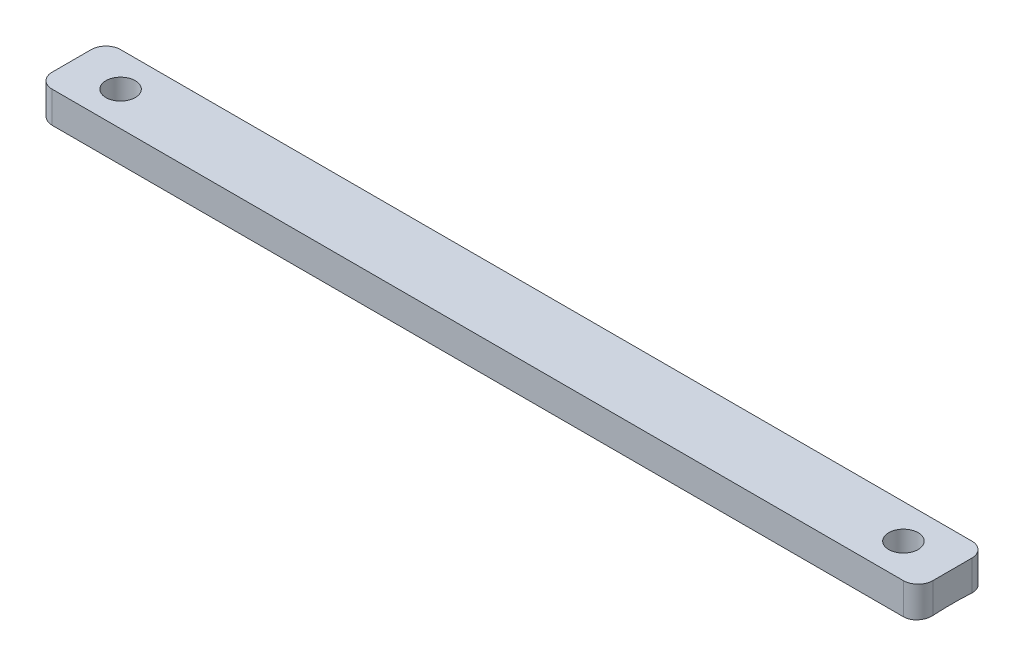
ISO-10303-21;
HEADER;
FILE_DESCRIPTION(('STEP AP214'),'2;1');
FILE_NAME('part.step','',(''),(''),'','','');
FILE_SCHEMA(('AUTOMOTIVE_DESIGN { 1 0 10303 214 1 1 1 1 }'));
ENDSEC;
DATA;
#1=APPLICATION_CONTEXT('core data for automotive mechanical design processes');
#2=APPLICATION_PROTOCOL_DEFINITION('international standard','automotive_design',2000,#1);
#3=PRODUCT_CONTEXT('',#1,'mechanical');
#4=PRODUCT('Part','Part','',(#3));
#5=PRODUCT_RELATED_PRODUCT_CATEGORY('part','',(#4));
#6=PRODUCT_DEFINITION_FORMATION('','',#4);
#7=PRODUCT_DEFINITION_CONTEXT('part definition',#1,'design');
#8=PRODUCT_DEFINITION('design','',#6,#7);
#9=PRODUCT_DEFINITION_SHAPE('','',#8);
#10=(LENGTH_UNIT() NAMED_UNIT(*) SI_UNIT(.MILLI.,.METRE.));
#11=(NAMED_UNIT(*) PLANE_ANGLE_UNIT() SI_UNIT($,.RADIAN.));
#12=(NAMED_UNIT(*) SI_UNIT($,.STERADIAN.) SOLID_ANGLE_UNIT());
#13=UNCERTAINTY_MEASURE_WITH_UNIT(LENGTH_MEASURE(1.E-05),#10,'distance_accuracy_value','');
#14=(GEOMETRIC_REPRESENTATION_CONTEXT(3) GLOBAL_UNCERTAINTY_ASSIGNED_CONTEXT((#13)) GLOBAL_UNIT_ASSIGNED_CONTEXT((#10,
#11,#12)) REPRESENTATION_CONTEXT('',''));
#15=CARTESIAN_POINT('',(0.,0.,0.));
#16=DIRECTION('',(0.,0.,1.));
#17=DIRECTION('',(1.,0.,0.));
#18=AXIS2_PLACEMENT_3D('',#15,#16,#17);
#19=CARTESIAN_POINT('',(0.,3.2,0.));
#20=DIRECTION('',(0.,-1.,0.));
#21=DIRECTION('',(0.,0.,-1.));
#22=AXIS2_PLACEMENT_3D('',#19,#20,#21);
#23=PLANE('',#22);
#24=DIRECTION('',(-1.,0.,0.));
#25=VECTOR('',#24,1.);
#26=CARTESIAN_POINT('',(0.,3.2,-7.));
#27=LINE('',#26,#25);
#28=CARTESIAN_POINT('',(88.5,3.2,-7.));
#29=VERTEX_POINT('',#28);
#30=CARTESIAN_POINT('',(1.5,3.2,-7.));
#31=VERTEX_POINT('',#30);
#32=EDGE_CURVE('E244',#29,#31,#27,.T.);
#33=ORIENTED_EDGE('',*,*,#32,.T.);
#34=CARTESIAN_POINT('',(1.5,3.2,-5.5));
#35=DIRECTION('',(0.,-1.,0.));
#36=DIRECTION('',(0.,0.,-1.));
#37=AXIS2_PLACEMENT_3D('',#34,#35,#36);
#38=CIRCLE('',#37,1.5);
#39=CARTESIAN_POINT('',(0.,3.2,-5.5));
#40=VERTEX_POINT('',#39);
#41=EDGE_CURVE('E231',#31,#40,#38,.F.);
#42=ORIENTED_EDGE('',*,*,#41,.T.);
#43=DIRECTION('',(0.,0.,1.));
#44=VECTOR('',#43,1.);
#45=CARTESIAN_POINT('',(0.,3.2,0.));
#46=LINE('',#45,#44);
#47=CARTESIAN_POINT('',(0.,3.2,-1.5));
#48=VERTEX_POINT('',#47);
#49=EDGE_CURVE('E120',#40,#48,#46,.T.);
#50=ORIENTED_EDGE('',*,*,#49,.T.);
#51=CARTESIAN_POINT('',(1.5,3.2,-1.5));
#52=DIRECTION('',(0.,-1.,0.));
#53=DIRECTION('',(0.,0.,-1.));
#54=AXIS2_PLACEMENT_3D('',#51,#52,#53);
#55=CIRCLE('',#54,1.5);
#56=CARTESIAN_POINT('',(1.5,3.2,0.));
#57=VERTEX_POINT('',#56);
#58=EDGE_CURVE('E229',#48,#57,#55,.F.);
#59=ORIENTED_EDGE('',*,*,#58,.T.);
#60=DIRECTION('',(1.,0.,0.));
#61=VECTOR('',#60,1.);
#62=CARTESIAN_POINT('',(0.,3.2,0.));
#63=LINE('',#62,#61);
#64=CARTESIAN_POINT('',(88.5,3.2,0.));
#65=VERTEX_POINT('',#64);
#66=EDGE_CURVE('E246',#57,#65,#63,.T.);
#67=ORIENTED_EDGE('',*,*,#66,.T.);
#68=CARTESIAN_POINT('',(88.5,3.2,-1.5));
#69=DIRECTION('',(0.,-1.,0.));
#70=DIRECTION('',(0.,0.,-1.));
#71=AXIS2_PLACEMENT_3D('',#68,#69,#70);
#72=CIRCLE('',#71,1.5);
#73=CARTESIAN_POINT('',(90.,3.2,-1.5));
#74=VERTEX_POINT('',#73);
#75=EDGE_CURVE('E56',#65,#74,#72,.F.);
#76=ORIENTED_EDGE('',*,*,#75,.T.);
#77=DIRECTION('',(0.,0.,-1.));
#78=VECTOR('',#77,1.);
#79=CARTESIAN_POINT('',(90.,3.2,0.));
#80=LINE('',#79,#78);
#81=CARTESIAN_POINT('',(90.,3.2,-5.5));
#82=VERTEX_POINT('',#81);
#83=EDGE_CURVE('E239',#74,#82,#80,.T.);
#84=ORIENTED_EDGE('',*,*,#83,.T.);
#85=CARTESIAN_POINT('',(88.5,3.2,-5.5));
#86=DIRECTION('',(0.,-1.,0.));
#87=DIRECTION('',(0.,0.,-1.));
#88=AXIS2_PLACEMENT_3D('',#85,#86,#87);
#89=CIRCLE('',#88,1.5);
#90=EDGE_CURVE('E228',#82,#29,#89,.F.);
#91=ORIENTED_EDGE('',*,*,#90,.T.);
#92=EDGE_LOOP('',(#33,#42,#50,#59,#67,#76,#84,#91));
#93=FACE_BOUND('',#92,.T.);
#94=CARTESIAN_POINT('',(5.,3.2,-3.5));
#95=DIRECTION('',(0.,1.,0.));
#96=DIRECTION('',(0.,0.,1.));
#97=AXIS2_PLACEMENT_3D('',#94,#95,#96);
#98=CIRCLE('',#97,1.5);
#99=CARTESIAN_POINT('',(5.,3.2,-2.));
#100=VERTEX_POINT('',#99);
#101=EDGE_CURVE('E224',#100,#100,#98,.T.);
#102=ORIENTED_EDGE('',*,*,#101,.F.);
#103=EDGE_LOOP('',(#102));
#104=FACE_BOUND('',#103,.T.);
#105=CARTESIAN_POINT('',(85.,3.2,-3.5));
#106=DIRECTION('',(0.,1.,0.));
#107=DIRECTION('',(0.,0.,1.));
#108=AXIS2_PLACEMENT_3D('',#105,#106,#107);
#109=CIRCLE('',#108,1.5);
#110=CARTESIAN_POINT('',(85.,3.2,-2.));
#111=VERTEX_POINT('',#110);
#112=EDGE_CURVE('E140',#111,#111,#109,.T.);
#113=ORIENTED_EDGE('',*,*,#112,.F.);
#114=EDGE_LOOP('',(#113));
#115=FACE_BOUND('',#114,.T.);
#116=ADVANCED_FACE('F33',(#93,#104,#115),#23,.F.);
#117=CARTESIAN_POINT('',(0.,3.2,0.));
#118=DIRECTION('',(1.,0.,0.));
#119=DIRECTION('',(0.,0.,-1.));
#120=AXIS2_PLACEMENT_3D('',#117,#118,#119);
#121=PLANE('',#120);
#122=ORIENTED_EDGE('',*,*,#49,.F.);
#123=DIRECTION('',(0.,-1.,0.));
#124=VECTOR('',#123,1.);
#125=CARTESIAN_POINT('',(0.,3.2,-5.5));
#126=LINE('',#125,#124);
#127=CARTESIAN_POINT('',(0.,0.111818930396308,-5.5));
#128=VERTEX_POINT('',#127);
#129=EDGE_CURVE('E104',#40,#128,#126,.T.);
#130=ORIENTED_EDGE('',*,*,#129,.T.);
#131=CARTESIAN_POINT('',(0.,-36.834087473426,-3.5));
#132=DIRECTION('',(1.,0.,0.));
#133=DIRECTION('',(0.,0.,-1.));
#134=AXIS2_PLACEMENT_3D('',#131,#132,#133);
#135=CIRCLE('',#134,37.);
#136=CARTESIAN_POINT('',(0.,0.111818930396308,-1.5));
#137=VERTEX_POINT('',#136);
#138=EDGE_CURVE('E117',#128,#137,#135,.T.);
#139=ORIENTED_EDGE('',*,*,#138,.T.);
#140=DIRECTION('',(0.,-1.,0.));
#141=VECTOR('',#140,1.);
#142=CARTESIAN_POINT('',(0.,3.2,-1.5));
#143=LINE('',#142,#141);
#144=EDGE_CURVE('E122',#137,#48,#143,.F.);
#145=ORIENTED_EDGE('',*,*,#144,.T.);
#146=EDGE_LOOP('',(#122,#130,#139,#145));
#147=FACE_BOUND('',#146,.T.);
#148=ADVANCED_FACE('F116',(#147),#121,.F.);
#149=CARTESIAN_POINT('',(0.,3.2,0.));
#150=DIRECTION('',(0.,0.,-1.));
#151=DIRECTION('',(-1.,0.,0.));
#152=AXIS2_PLACEMENT_3D('',#149,#150,#151);
#153=PLANE('',#152);
#154=DIRECTION('',(1.,0.,0.));
#155=VECTOR('',#154,1.);
#156=CARTESIAN_POINT('',(0.,0.,0.));
#157=LINE('',#156,#155);
#158=CARTESIAN_POINT('',(1.5,0.,0.));
#159=VERTEX_POINT('',#158);
#160=CARTESIAN_POINT('',(88.5,0.,0.));
#161=VERTEX_POINT('',#160);
#162=EDGE_CURVE('E219',#159,#161,#157,.T.);
#163=ORIENTED_EDGE('',*,*,#162,.T.);
#164=DIRECTION('',(0.,-1.,0.));
#165=VECTOR('',#164,1.);
#166=CARTESIAN_POINT('',(88.5,3.2,0.));
#167=LINE('',#166,#165);
#168=EDGE_CURVE('E11',#161,#65,#167,.F.);
#169=ORIENTED_EDGE('',*,*,#168,.T.);
#170=ORIENTED_EDGE('',*,*,#66,.F.);
#171=DIRECTION('',(0.,-1.,0.));
#172=VECTOR('',#171,1.);
#173=CARTESIAN_POINT('',(1.5,3.2,0.));
#174=LINE('',#173,#172);
#175=EDGE_CURVE('E42',#57,#159,#174,.T.);
#176=ORIENTED_EDGE('',*,*,#175,.T.);
#177=EDGE_LOOP('',(#163,#169,#170,#176));
#178=FACE_BOUND('',#177,.T.);
#179=ADVANCED_FACE('F202',(#178),#153,.F.);
#180=CARTESIAN_POINT('',(90.,3.2,0.));
#181=DIRECTION('',(-1.,0.,0.));
#182=DIRECTION('',(0.,0.,1.));
#183=AXIS2_PLACEMENT_3D('',#180,#181,#182);
#184=PLANE('',#183);
#185=CARTESIAN_POINT('',(90.,-36.834087473426,-3.5));
#186=DIRECTION('',(1.,0.,0.));
#187=DIRECTION('',(0.,0.,-1.));
#188=AXIS2_PLACEMENT_3D('',#185,#186,#187);
#189=CIRCLE('',#188,37.);
#190=CARTESIAN_POINT('',(90.,0.111818930396308,-5.5));
#191=VERTEX_POINT('',#190);
#192=CARTESIAN_POINT('',(90.,0.111818930396308,-1.5));
#193=VERTEX_POINT('',#192);
#194=EDGE_CURVE('E139',#191,#193,#189,.T.);
#195=ORIENTED_EDGE('',*,*,#194,.F.);
#196=DIRECTION('',(0.,-1.,0.));
#197=VECTOR('',#196,1.);
#198=CARTESIAN_POINT('',(90.,3.2,-5.5));
#199=LINE('',#198,#197);
#200=EDGE_CURVE('E49',#191,#82,#199,.F.);
#201=ORIENTED_EDGE('',*,*,#200,.T.);
#202=ORIENTED_EDGE('',*,*,#83,.F.);
#203=DIRECTION('',(0.,-1.,0.));
#204=VECTOR('',#203,1.);
#205=CARTESIAN_POINT('',(90.,3.2,-1.5));
#206=LINE('',#205,#204);
#207=EDGE_CURVE('E227',#74,#193,#206,.T.);
#208=ORIENTED_EDGE('',*,*,#207,.T.);
#209=EDGE_LOOP('',(#195,#201,#202,#208));
#210=FACE_BOUND('',#209,.T.);
#211=ADVANCED_FACE('F209',(#210),#184,.F.);
#212=CARTESIAN_POINT('',(0.,3.2,-7.));
#213=DIRECTION('',(0.,0.,1.));
#214=DIRECTION('',(1.,0.,0.));
#215=AXIS2_PLACEMENT_3D('',#212,#213,#214);
#216=PLANE('',#215);
#217=DIRECTION('',(-1.,0.,0.));
#218=VECTOR('',#217,1.);
#219=CARTESIAN_POINT('',(0.,0.,-7.));
#220=LINE('',#219,#218);
#221=CARTESIAN_POINT('',(88.5,0.,-7.));
#222=VERTEX_POINT('',#221);
#223=CARTESIAN_POINT('',(1.5,0.,-7.));
#224=VERTEX_POINT('',#223);
#225=EDGE_CURVE('E223',#222,#224,#220,.T.);
#226=ORIENTED_EDGE('',*,*,#225,.T.);
#227=DIRECTION('',(0.,-1.,0.));
#228=VECTOR('',#227,1.);
#229=CARTESIAN_POINT('',(1.5,3.2,-7.));
#230=LINE('',#229,#228);
#231=EDGE_CURVE('E105',#224,#31,#230,.F.);
#232=ORIENTED_EDGE('',*,*,#231,.T.);
#233=ORIENTED_EDGE('',*,*,#32,.F.);
#234=DIRECTION('',(0.,-1.,0.));
#235=VECTOR('',#234,1.);
#236=CARTESIAN_POINT('',(88.5,3.2,-7.));
#237=LINE('',#236,#235);
#238=EDGE_CURVE('E110',#29,#222,#237,.T.);
#239=ORIENTED_EDGE('',*,*,#238,.T.);
#240=EDGE_LOOP('',(#226,#232,#233,#239));
#241=FACE_BOUND('',#240,.T.);
#242=ADVANCED_FACE('F206',(#241),#216,.F.);
#243=CARTESIAN_POINT('',(5.,3.2,-3.5));
#244=DIRECTION('',(0.,-1.,0.));
#245=DIRECTION('',(0.,0.,-1.));
#246=AXIS2_PLACEMENT_3D('',#243,#244,#245);
#247=CYLINDRICAL_SURFACE('',#246,1.5);
#248=CARTESIAN_POINT('',(5.,0.135494617801352,-5.));
#249=CARTESIAN_POINT('',(4.91578149422969,0.135495027395254,-4.99999627675517));
#250=CARTESIAN_POINT('',(4.83150280330698,0.135785490756815,-4.9928834288181));
#251=CARTESIAN_POINT('',(4.66526904939991,0.136916204404326,-4.96460899887275));
#252=CARTESIAN_POINT('',(4.58331686499343,0.137757107244809,-4.94343074166795));
#253=CARTESIAN_POINT('',(4.42416832708252,0.139893288807477,-4.88763166685569));
#254=CARTESIAN_POINT('',(4.34696962375158,0.141188340871768,-4.85301755392828));
#255=CARTESIAN_POINT('',(4.19949975976174,0.144086606503954,-4.77133927142248));
#256=CARTESIAN_POINT('',(4.12922693956124,0.14568974597674,-4.72427809434462));
#257=CARTESIAN_POINT('',(3.99753211459871,0.149024864230531,-4.6190034425289));
#258=CARTESIAN_POINT('',(3.93611560786369,0.150756922041597,-4.56078309192671));
#259=CARTESIAN_POINT('',(3.82392345672616,0.154153946140237,-4.43485590545194));
#260=CARTESIAN_POINT('',(3.77314824097075,0.155818909722974,-4.3671486876174));
#261=CARTESIAN_POINT('',(3.68366712391673,0.158894625039714,-4.22414384124868));
#262=CARTESIAN_POINT('',(3.64496516265188,0.160305293722843,-4.14884374541066));
#263=CARTESIAN_POINT('',(3.58075455080634,0.162712688784949,-3.99280808054436));
#264=CARTESIAN_POINT('',(3.55524582553129,0.163709417507466,-3.91207254229211));
#265=CARTESIAN_POINT('',(3.51815936795679,0.165176098644411,-3.74750523226817));
#266=CARTESIAN_POINT('',(3.5065739143982,0.165646343014944,-3.66367520318237));
#267=CARTESIAN_POINT('',(3.4976390555308,0.166008033784721,-3.49525896702363));
#268=CARTESIAN_POINT('',(3.50028956774436,0.165899483537274,-3.4106727643345));
#269=CARTESIAN_POINT('',(3.51974495460899,0.165116066842078,-3.24319755704319));
#270=CARTESIAN_POINT('',(3.53654151054275,0.164441533227166,-3.16030758429394));
#271=CARTESIAN_POINT('',(3.58379930811651,0.162602534405476,-2.9985247752679));
#272=CARTESIAN_POINT('',(3.61426059252323,0.161438067665348,-2.9196319515019));
#273=CARTESIAN_POINT('',(3.68799268226146,0.158749836658731,-2.76805611635972));
#274=CARTESIAN_POINT('',(3.73126728982647,0.157225965769779,-2.69537495649789));
#275=CARTESIAN_POINT('',(3.82939482434616,0.153990605049316,-2.55830586340704));
#276=CARTESIAN_POINT('',(3.8842478034732,0.152279114372403,-2.49391796754972));
#277=CARTESIAN_POINT('',(4.00402206338165,0.14885987479768,-2.37521463902075));
#278=CARTESIAN_POINT('',(4.06895056073248,0.147152129478595,-2.32090648765586));
#279=CARTESIAN_POINT('',(4.20700737314865,0.143934149379912,-2.22396032771798));
#280=CARTESIAN_POINT('',(4.28013568989584,0.142423914640825,-2.18132232153865));
#281=CARTESIAN_POINT('',(4.43252053567254,0.139771347139842,-2.1089275042879));
#282=CARTESIAN_POINT('',(4.51177718535114,0.138629021623299,-2.07917094689095));
#283=CARTESIAN_POINT('',(4.67416697794267,0.136841376581463,-2.03338847454723));
#284=CARTESIAN_POINT('',(4.75730010166373,0.136196054595853,-2.01736249162996));
#285=CARTESIAN_POINT('',(4.92501961243847,0.135475635923309,-1.99950505413273));
#286=CARTESIAN_POINT('',(5.00960492283799,0.135400133640323,-1.9976635030951));
#287=CARTESIAN_POINT('',(5.17788343308833,0.135826809804136,-2.00820087599657));
#288=CARTESIAN_POINT('',(5.26157663486198,0.136328987005553,-2.02057976927873));
#289=CARTESIAN_POINT('',(5.42566692699197,0.137854046634284,-2.05919827213054));
#290=CARTESIAN_POINT('',(5.50606510256944,0.13887675611006,-2.08543327799097));
#291=CARTESIAN_POINT('',(5.66131650889221,0.141327453283704,-2.15101462855725));
#292=CARTESIAN_POINT('',(5.73616971872265,0.142755442510135,-2.1903610227144));
#293=CARTESIAN_POINT('',(5.87825286861417,0.145856725006385,-2.28107422395748));
#294=CARTESIAN_POINT('',(5.94547846926489,0.147530156681694,-2.33244782301772));
#295=CARTESIAN_POINT('',(6.0703544961279,0.150933204219999,-2.44574717751986));
#296=CARTESIAN_POINT('',(6.12800488084099,0.15266282032646,-2.5076729786929));
#297=CARTESIAN_POINT('',(6.2321278018047,0.155984456198172,-2.64036219371403));
#298=CARTESIAN_POINT('',(6.27859382284995,0.157576395418532,-2.7111307224143));
#299=CARTESIAN_POINT('',(6.35898448656521,0.160442095023968,-2.85947057123992));
#300=CARTESIAN_POINT('',(6.39290916977911,0.161715856437652,-2.93704186937213));
#301=CARTESIAN_POINT('',(6.44724274087678,0.163801244605767,-3.09676088104531));
#302=CARTESIAN_POINT('',(6.46765582457824,0.164613014813414,-3.17890716529653));
#303=CARTESIAN_POINT('',(6.49440049273741,0.165683493002134,-3.34546443663322));
#304=CARTESIAN_POINT('',(6.50073212070143,0.165942202691951,-3.42987541672084));
#305=CARTESIAN_POINT('',(6.49913367226896,0.165877409749781,-3.59850111875331));
#306=CARTESIAN_POINT('',(6.49121383440228,0.165554325090033,-3.68271593810557));
#307=CARTESIAN_POINT('',(6.4613583869192,0.164363154298441,-3.84861943421668));
#308=CARTESIAN_POINT('',(6.43942275009534,0.163495067108639,-3.93030810607144));
#309=CARTESIAN_POINT('',(6.38216024126843,0.161311616578426,-4.08884321873271));
#310=CARTESIAN_POINT('',(6.34683319123332,0.159996247291649,-4.16568959514751));
#311=CARTESIAN_POINT('',(6.26379295626649,0.157066312302912,-4.31236017329816));
#312=CARTESIAN_POINT('',(6.21608018771906,0.155451756659549,-4.38218461098878));
#313=CARTESIAN_POINT('',(6.10958813688633,0.152104000312768,-4.51287919981425));
#314=CARTESIAN_POINT('',(6.05080211246586,0.150370727737904,-4.57374385520294));
#315=CARTESIAN_POINT('',(5.92382929222847,0.146981222673613,-4.68475804106933));
#316=CARTESIAN_POINT('',(5.85564017921467,0.1453250093088,-4.73490492258198));
#317=CARTESIAN_POINT('',(5.71175768861311,0.142275586241885,-4.82307551779675));
#318=CARTESIAN_POINT('',(5.63605841051896,0.140882585874027,-4.8610895986573));
#319=CARTESIAN_POINT('',(5.47940397240922,0.138520225678819,-4.92382399077863));
#320=CARTESIAN_POINT('',(5.39845518109115,0.137550363150592,-4.94856008479572));
#321=CARTESIAN_POINT('',(5.26416575660061,0.136401760460014,-4.97751209500751));
#322=CARTESIAN_POINT('',(5.21169594633199,0.136063070234594,-4.98593437638431));
#323=CARTESIAN_POINT('',(5.10615872975972,0.135609369862839,-4.99717950090678));
#324=CARTESIAN_POINT('',(5.0530913237848,0.135494359593464,-5.00000234713256));
#325=CARTESIAN_POINT('',(5.,0.135494617801352,-5.));
#326=B_SPLINE_CURVE_WITH_KNOTS('',3,(#248,#249,#250,#251,#252,#253,#254,#255,#256,#257,#258,
#259,#260,#261,#262,#263,#264,#265,#266,#267,#268,#269,#270,#271,#272,#273,#274,#275,#276,#277,
#278,#279,#280,#281,#282,#283,#284,#285,#286,#287,#288,#289,#290,#291,#292,#293,#294,#295,#296,
#297,#298,#299,#300,#301,#302,#303,#304,#305,#306,#307,#308,#309,#310,#311,#312,#313,#314,#315,
#316,#317,#318,#319,#320,#321,#322,#323,#324,#325),.UNSPECIFIED.,.T.,.F.,(4,2,2,2,2,2,2,2,2,2,2,
2,2,2,2,2,2,2,2,2,2,2,2,2,2,2,2,2,2,2,2,2,2,2,2,2,2,2,4),(0.,0.25246172084605,0.505223282357675,
0.757858874130214,1.01043378283718,1.26316482195447,1.51590603949987,1.76872965153949,
2.02155183218601,2.27423374352406,2.52691419092312,2.77944615081933,3.03197890107429,
3.28458666328422,3.53719556377393,3.78998623717143,4.04277696241849,4.29557266564892,
4.54836711745664,4.80098161390297,5.05359556575485,5.30612563908342,5.55865666487252,
5.81133064484513,6.06400571988382,6.31682763093408,6.56964872464942,6.82239127181599,
7.07513303810386,7.32769330228503,7.58025405673746,7.83281816897477,8.08537379158653,
8.33808368685274,8.59085596891144,8.84382844324799,9.09649955457983,9.25565144423951,
9.41480324635365),.UNSPECIFIED.);
#327=CARTESIAN_POINT('',(5.,0.135494617801352,-5.));
#328=VERTEX_POINT('',#327);
#329=EDGE_CURVE('E129',#328,#328,#326,.T.);
#330=ORIENTED_EDGE('',*,*,#329,.F.);
#331=EDGE_LOOP('',(#330));
#332=FACE_BOUND('',#331,.T.);
#333=ORIENTED_EDGE('',*,*,#101,.T.);
#334=EDGE_LOOP('',(#333));
#335=FACE_BOUND('',#334,.T.);
#336=ADVANCED_FACE('F142',(#332,#335),#247,.F.);
#337=CARTESIAN_POINT('',(85.,3.2,-3.5));
#338=DIRECTION('',(0.,-1.,0.));
#339=DIRECTION('',(0.,0.,-1.));
#340=AXIS2_PLACEMENT_3D('',#337,#338,#339);
#341=CYLINDRICAL_SURFACE('',#340,1.5);
#342=CARTESIAN_POINT('',(85.,0.135494617801352,-5.));
#343=CARTESIAN_POINT('',(84.9157814942297,0.135495027395256,-4.99999627675516));
#344=CARTESIAN_POINT('',(84.831502803307,0.135785490756822,-4.9928834288181));
#345=CARTESIAN_POINT('',(84.6652690493999,0.136916204404334,-4.96460899887275));
#346=CARTESIAN_POINT('',(84.5833168649934,0.137757107244812,-4.94343074166795));
#347=CARTESIAN_POINT('',(84.4241683270825,0.139893288807475,-4.88763166685569));
#348=CARTESIAN_POINT('',(84.3469696237516,0.141188340871767,-4.85301755392828));
#349=CARTESIAN_POINT('',(84.1994997597617,0.14408660650395,-4.77133927142247));
#350=CARTESIAN_POINT('',(84.1292269395612,0.145689745976733,-4.72427809434461));
#351=CARTESIAN_POINT('',(83.9975321145987,0.149024864230525,-4.61900344252889));
#352=CARTESIAN_POINT('',(83.9361156078637,0.150756922041597,-4.56078309192671));
#353=CARTESIAN_POINT('',(83.8239234567261,0.154153946140236,-4.43485590545194));
#354=CARTESIAN_POINT('',(83.7731482409708,0.155818909722967,-4.36714868761739));
#355=CARTESIAN_POINT('',(83.6836671239167,0.158894625039709,-4.22414384124867));
#356=CARTESIAN_POINT('',(83.6449651626519,0.160305293722846,-4.14884374541065));
#357=CARTESIAN_POINT('',(83.5807545508063,0.162712688784955,-3.99280808054435));
#358=CARTESIAN_POINT('',(83.5552458255313,0.163709417507468,-3.91207254229211));
#359=CARTESIAN_POINT('',(83.5181593679568,0.16517609864441,-3.74750523226817));
#360=CARTESIAN_POINT('',(83.5065739143982,0.165646343014945,-3.66367520318237));
#361=CARTESIAN_POINT('',(83.4976390555308,0.166008033784723,-3.49525896702363));
#362=CARTESIAN_POINT('',(83.5002895677444,0.165899483537275,-3.4106727643345));
#363=CARTESIAN_POINT('',(83.519744954609,0.165116066842078,-3.24319755704318));
#364=CARTESIAN_POINT('',(83.5365415105427,0.164441533227166,-3.16030758429394));
#365=CARTESIAN_POINT('',(83.5837993081165,0.162602534405477,-2.9985247752679));
#366=CARTESIAN_POINT('',(83.6142605925232,0.161438067665348,-2.91963195150191));
#367=CARTESIAN_POINT('',(83.6879926822615,0.158749836658732,-2.76805611635972));
#368=CARTESIAN_POINT('',(83.7312672898265,0.15722596576978,-2.69537495649789));
#369=CARTESIAN_POINT('',(83.8293948243462,0.153990605049317,-2.55830586340704));
#370=CARTESIAN_POINT('',(83.8842478034732,0.152279114372404,-2.49391796754972));
#371=CARTESIAN_POINT('',(84.0040220633816,0.14885987479768,-2.37521463902075));
#372=CARTESIAN_POINT('',(84.0689505607325,0.147152129478595,-2.32090648765586));
#373=CARTESIAN_POINT('',(84.2070073731486,0.143934149379912,-2.22396032771799));
#374=CARTESIAN_POINT('',(84.2801356898958,0.142423914640825,-2.18132232153866));
#375=CARTESIAN_POINT('',(84.4325205356725,0.139771347139843,-2.1089275042879));
#376=CARTESIAN_POINT('',(84.5117771853511,0.1386290216233,-2.07917094689096));
#377=CARTESIAN_POINT('',(84.6741669779426,0.136841376581463,-2.03338847454724));
#378=CARTESIAN_POINT('',(84.7573001016637,0.136196054595853,-2.01736249162996));
#379=CARTESIAN_POINT('',(84.9250196124385,0.135475635923309,-1.99950505413273));
#380=CARTESIAN_POINT('',(85.009604922838,0.135400133640322,-1.9976635030951));
#381=CARTESIAN_POINT('',(85.1778834330883,0.135826809804136,-2.00820087599657));
#382=CARTESIAN_POINT('',(85.261576634862,0.136328987005553,-2.02057976927873));
#383=CARTESIAN_POINT('',(85.425666926992,0.137854046634284,-2.05919827213054));
#384=CARTESIAN_POINT('',(85.5060651025695,0.138876756110059,-2.08543327799097));
#385=CARTESIAN_POINT('',(85.6613165088922,0.141327453283704,-2.15101462855725));
#386=CARTESIAN_POINT('',(85.7361697187226,0.142755442510134,-2.19036102271441));
#387=CARTESIAN_POINT('',(85.8782528686142,0.145856725006384,-2.28107422395749));
#388=CARTESIAN_POINT('',(85.9454784692649,0.147530156681693,-2.33244782301772));
#389=CARTESIAN_POINT('',(86.0703544961279,0.150933204219998,-2.44574717751986));
#390=CARTESIAN_POINT('',(86.128004880841,0.152662820326459,-2.5076729786929));
#391=CARTESIAN_POINT('',(86.2321278018047,0.155984456198171,-2.64036219371403));
#392=CARTESIAN_POINT('',(86.2785938228499,0.157576395418531,-2.7111307224143));
#393=CARTESIAN_POINT('',(86.3589844865652,0.160442095023967,-2.85947057123992));
#394=CARTESIAN_POINT('',(86.3929091697791,0.161715856437651,-2.93704186937213));
#395=CARTESIAN_POINT('',(86.4472427408768,0.163801244605765,-3.09676088104532));
#396=CARTESIAN_POINT('',(86.4676558245782,0.164613014813413,-3.17890716529654));
#397=CARTESIAN_POINT('',(86.4944004927374,0.165683493002133,-3.34546443663323));
#398=CARTESIAN_POINT('',(86.5007321207014,0.16594220269195,-3.42987541672084));
#399=CARTESIAN_POINT('',(86.499133672269,0.165877409749779,-3.59850111875331));
#400=CARTESIAN_POINT('',(86.4912138344023,0.165554325090031,-3.68271593810558));
#401=CARTESIAN_POINT('',(86.4613583869192,0.16436315429844,-3.84861943421668));
#402=CARTESIAN_POINT('',(86.4394227500953,0.163495067108638,-3.93030810607145));
#403=CARTESIAN_POINT('',(86.3821602412684,0.161311616578425,-4.08884321873271));
#404=CARTESIAN_POINT('',(86.3468331912333,0.159996247291648,-4.16568959514751));
#405=CARTESIAN_POINT('',(86.2637929562665,0.157066312302911,-4.31236017329817));
#406=CARTESIAN_POINT('',(86.216080187719,0.155451756659548,-4.38218461098879));
#407=CARTESIAN_POINT('',(86.1095881368863,0.152104000312766,-4.51287919981425));
#408=CARTESIAN_POINT('',(86.0508021124658,0.150370727737903,-4.57374385520294));
#409=CARTESIAN_POINT('',(85.9238292922285,0.146981222673613,-4.68475804106933));
#410=CARTESIAN_POINT('',(85.8556401792147,0.145325009308799,-4.73490492258197));
#411=CARTESIAN_POINT('',(85.7117576886131,0.142275586241884,-4.82307551779675));
#412=CARTESIAN_POINT('',(85.636058410519,0.140882585874026,-4.8610895986573));
#413=CARTESIAN_POINT('',(85.4794039724092,0.138520225678819,-4.92382399077863));
#414=CARTESIAN_POINT('',(85.3984551810911,0.137550363150591,-4.94856008479571));
#415=CARTESIAN_POINT('',(85.2641657566006,0.136401760460014,-4.9775120950075));
#416=CARTESIAN_POINT('',(85.211695946332,0.136063070234594,-4.9859343763843));
#417=CARTESIAN_POINT('',(85.1061587297597,0.135609369862838,-4.99717950090678));
#418=CARTESIAN_POINT('',(85.0530913237848,0.135494359593463,-5.00000234713256));
#419=CARTESIAN_POINT('',(85.,0.135494617801352,-5.));
#420=B_SPLINE_CURVE_WITH_KNOTS('',3,(#342,#343,#344,#345,#346,#347,#348,#349,#350,#351,#352,
#353,#354,#355,#356,#357,#358,#359,#360,#361,#362,#363,#364,#365,#366,#367,#368,#369,#370,#371,
#372,#373,#374,#375,#376,#377,#378,#379,#380,#381,#382,#383,#384,#385,#386,#387,#388,#389,#390,
#391,#392,#393,#394,#395,#396,#397,#398,#399,#400,#401,#402,#403,#404,#405,#406,#407,#408,#409,
#410,#411,#412,#413,#414,#415,#416,#417,#418,#419),.UNSPECIFIED.,.T.,.F.,(4,2,2,2,2,2,2,2,2,2,2,
2,2,2,2,2,2,2,2,2,2,2,2,2,2,2,2,2,2,2,2,2,2,2,2,2,2,2,4),(0.,0.252461720846043,
0.505223282357677,0.757858874130206,1.01043378283718,1.26316482195448,1.51590603949987,
1.76872965153949,2.02155183218601,2.27423374352406,2.52691419092312,2.77944615081933,
3.03197890107429,3.28458666328421,3.53719556377392,3.78998623717141,4.04277696241847,
4.29557266564889,4.54836711745664,4.80098161390296,5.05359556575485,5.30612563908342,
5.55865666487251,5.81133064484512,6.06400571988381,6.31682763093406,6.56964872464941,
6.82239127181598,7.07513303810384,7.32769330228502,7.58025405673744,7.83281816897476,
8.08537379158652,8.33808368685272,8.5908559689114,8.84382844324797,9.09649955457982,
9.25565144423949,9.41480324635362),.UNSPECIFIED.);
#421=CARTESIAN_POINT('',(85.,0.135494617801352,-5.));
#422=VERTEX_POINT('',#421);
#423=EDGE_CURVE('E126',#422,#422,#420,.T.);
#424=ORIENTED_EDGE('',*,*,#423,.F.);
#425=EDGE_LOOP('',(#424));
#426=FACE_BOUND('',#425,.T.);
#427=ORIENTED_EDGE('',*,*,#112,.T.);
#428=EDGE_LOOP('',(#427));
#429=FACE_BOUND('',#428,.T.);
#430=ADVANCED_FACE('F148',(#426,#429),#341,.F.);
#431=CARTESIAN_POINT('',(0.,-36.834087473426,-3.5));
#432=DIRECTION('',(1.,0.,0.));
#433=DIRECTION('',(0.,0.,-1.));
#434=AXIS2_PLACEMENT_3D('',#431,#432,#433);
#435=CYLINDRICAL_SURFACE('',#434,37.);
#436=ORIENTED_EDGE('',*,*,#329,.T.);
#437=EDGE_LOOP('',(#436));
#438=FACE_BOUND('',#437,.T.);
#439=ORIENTED_EDGE('',*,*,#423,.T.);
#440=EDGE_LOOP('',(#439));
#441=FACE_BOUND('',#440,.T.);
#442=ORIENTED_EDGE('',*,*,#138,.F.);
#443=CARTESIAN_POINT('',(0.,0.111818930396308,-5.5));
#444=CARTESIAN_POINT('',(2.93180981860592E-07,0.109530124641667,-5.54228854503644));
#445=CARTESIAN_POINT('',(0.00178942776322739,0.107168911897103,-5.58455269463939));
#446=CARTESIAN_POINT('',(0.0089250908702873,0.102320203858877,-5.66876984814328));
#447=CARTESIAN_POINT('',(0.0142714159681178,0.0998327157941041,-5.71072286969817));
#448=CARTESIAN_POINT('',(0.0355922805444683,0.0922167187140933,-5.83558978578821));
#449=CARTESIAN_POINT('',(0.0568488649268215,0.086926905373986,-5.91765457016882));
#450=CARTESIAN_POINT('',(0.112848435803186,0.0761461398017804,-6.07702459450508));
#451=CARTESIAN_POINT('',(0.147597311692387,0.0706551006836823,-6.15432773890499));
#452=CARTESIAN_POINT('',(0.229594641296518,0.059737246157073,-6.30199569703467));
#453=CARTESIAN_POINT('',(0.276841152520929,0.0543104209047143,-6.37236158668144));
#454=CARTESIAN_POINT('',(0.382539294563843,0.0438075549393981,-6.50420445630903));
#455=CARTESIAN_POINT('',(0.440998020729368,0.0387317391354815,-6.56567576414603));
#456=CARTESIAN_POINT('',(0.567470788361278,0.0292261456370303,-6.67793817662325));
#457=CARTESIAN_POINT('',(0.635486597966622,0.0247964877968054,-6.72872730062051));
#458=CARTESIAN_POINT('',(0.779010849508036,0.0168612322427139,-6.8180710159884));
#459=CARTESIAN_POINT('',(0.854506612003108,0.0133541064048754,-6.85664586152287));
#460=CARTESIAN_POINT('',(1.01093133265451,0.00747781520814557,-6.92054137646658));
#461=CARTESIAN_POINT('',(1.09185678476569,0.00510792342625833,-6.94587050767836));
#462=CARTESIAN_POINT('',(1.22775134496911,0.00226461337510279,-6.97610508451402));
#463=CARTESIAN_POINT('',(1.281846117005,0.00141739408238133,-6.98505993955801));
#464=CARTESIAN_POINT('',(1.39061942989561,0.000284449362504398,-6.99700665556581));
#465=CARTESIAN_POINT('',(1.44529705227329,-2.05682440590284E-06,-7.00000680818235));
#466=CARTESIAN_POINT('',(1.5,0.,-7.));
#467=B_SPLINE_CURVE_WITH_KNOTS('',3,(#443,#444,#445,#446,#447,#448,#449,#450,#451,#452,#453,
#454,#455,#456,#457,#458,#459,#460,#461,#462,#463,#464,#465,#466),.UNSPECIFIED.,.F.,.F.,(4,2,2,
2,2,2,2,2,2,2,2,4),(0.,0.126972956622096,0.253938652596875,0.507445772110494,0.761063672293075,
1.01464217612804,1.26838168290636,1.52216819553939,1.77553163900326,2.02873302714107,
2.19293847149616,2.35691510636623),.UNSPECIFIED.);
#468=EDGE_CURVE('E100',#128,#224,#467,.T.);
#469=ORIENTED_EDGE('',*,*,#468,.T.);
#470=ORIENTED_EDGE('',*,*,#225,.F.);
#471=CARTESIAN_POINT('',(88.5,0.,-7.));
#472=CARTESIAN_POINT('',(88.542081482843,-4.00599125304577E-07,-6.99999982573879));
#473=CARTESIAN_POINT('',(88.5841427385725,0.000168420222536474,-6.99822803173912));
#474=CARTESIAN_POINT('',(88.6679628489302,0.000839133773922316,-6.99116032920328));
#475=CARTESIAN_POINT('',(88.7097217216379,0.00134100642143461,-6.98586463314975));
#476=CARTESIAN_POINT('',(88.8340098919312,0.00333577617586415,-6.96474547917472));
#477=CARTESIAN_POINT('',(88.9157044038622,0.00531786445254672,-6.94368979481439));
#478=CARTESIAN_POINT('',(89.0743776615885,0.0104603238050002,-6.8882243128849));
#479=CARTESIAN_POINT('',(89.1513544091198,0.0136211902045897,-6.85380890129505));
#480=CARTESIAN_POINT('',(89.2984339852641,0.0209207627147485,-6.77261711377975));
#481=CARTESIAN_POINT('',(89.3685376799472,0.0250593453991143,-6.72584229800841));
#482=CARTESIAN_POINT('',(89.5000684706152,0.0340731027533347,-6.6211368463311));
#483=CARTESIAN_POINT('',(89.5614742544523,0.0389500281254493,-6.56317960339099));
#484=CARTESIAN_POINT('',(89.6737095627429,0.0491502973050367,-6.43780847831471));
#485=CARTESIAN_POINT('',(89.724536880263,0.0544737339415923,-6.37039262777736));
#486=CARTESIAN_POINT('',(89.8143513834154,0.0652964452189381,-6.22774582326252));
#487=CARTESIAN_POINT('',(89.8532926139129,0.070796313703852,-6.15248600881805));
#488=CARTESIAN_POINT('',(89.9179580105366,0.0816758377945148,-5.99650049517615));
#489=CARTESIAN_POINT('',(89.9436897800315,0.0870555608463349,-5.91577797067167));
#490=CARTESIAN_POINT('',(89.9749279298426,0.0957106974541842,-5.77881899622058));
#491=CARTESIAN_POINT('',(89.9843226343339,0.0990870298602292,-5.72344442704115));
#492=CARTESIAN_POINT('',(89.9968581602767,0.105624992389169,-5.61205678603064));
#493=CARTESIAN_POINT('',(90.0000075341573,0.108786910391118,-5.55604469316523));
#494=CARTESIAN_POINT('',(90.,0.111818930396308,-5.5));
#495=B_SPLINE_CURVE_WITH_KNOTS('',3,(#471,#472,#473,#474,#475,#476,#477,#478,#479,#480,#481,
#482,#483,#484,#485,#486,#487,#488,#489,#490,#491,#492,#493,#494),.UNSPECIFIED.,.F.,.F.,(4,2,2,
2,2,2,2,2,2,2,2,4),(0.,0.126166683369112,0.252325759886474,0.504188809898179,0.756157812498464,
1.00809502369344,1.26063924638131,1.5132361034272,1.76679755282025,2.02021288807762,
2.18868590380239,2.35692805084349),.UNSPECIFIED.);
#496=EDGE_CURVE('E111',#222,#191,#495,.T.);
#497=ORIENTED_EDGE('',*,*,#496,.T.);
#498=ORIENTED_EDGE('',*,*,#194,.T.);
#499=CARTESIAN_POINT('',(90.,0.111818930396308,-1.5));
#500=CARTESIAN_POINT('',(89.999999706819,0.109530124641667,-1.45771145496356));
#501=CARTESIAN_POINT('',(89.9982105722368,0.107168911897103,-1.41544730536062));
#502=CARTESIAN_POINT('',(89.9910749091297,0.102320203858877,-1.33123015185672));
#503=CARTESIAN_POINT('',(89.9857285840319,0.099832715794104,-1.28927713030183));
#504=CARTESIAN_POINT('',(89.9644077194555,0.0922167187140934,-1.16441021421179));
#505=CARTESIAN_POINT('',(89.9431511350732,0.0869269053739862,-1.08234542983118));
#506=CARTESIAN_POINT('',(89.8871515641968,0.0761461398017806,-0.922975405494925));
#507=CARTESIAN_POINT('',(89.8524026883076,0.0706551006836823,-0.84567226109501));
#508=CARTESIAN_POINT('',(89.7704053587035,0.0597372461570731,-0.698004302965333));
#509=CARTESIAN_POINT('',(89.7231588474791,0.0543104209047147,-0.62763841331856));
#510=CARTESIAN_POINT('',(89.6174607054361,0.0438075549393987,-0.495795543690973));
#511=CARTESIAN_POINT('',(89.5590019792706,0.0387317391354819,-0.434324235853969));
#512=CARTESIAN_POINT('',(89.4325292116387,0.0292261456370308,-0.322061823376746));
#513=CARTESIAN_POINT('',(89.3645134020334,0.0247964877968061,-0.271272699379491));
#514=CARTESIAN_POINT('',(89.220989150492,0.0168612322427147,-0.181928984011602));
#515=CARTESIAN_POINT('',(89.1454933879969,0.0133541064048758,-0.143354138477131));
#516=CARTESIAN_POINT('',(88.9890686673455,0.00747781520814614,-0.0794586235334177));
#517=CARTESIAN_POINT('',(88.9081432152343,0.00510792342625916,-0.0541294923216402));
#518=CARTESIAN_POINT('',(88.7722486550309,0.00226461337510379,-0.0238949154859771));
#519=CARTESIAN_POINT('',(88.718153882995,0.0014173940823823,-0.0149400604419941));
#520=CARTESIAN_POINT('',(88.6093805701044,0.000284449362505422,-0.00299334443418908));
#521=CARTESIAN_POINT('',(88.5547029477267,-2.05682440481567E-06,6.80818235448427E-06));
#522=CARTESIAN_POINT('',(88.5,0.,0.));
#523=B_SPLINE_CURVE_WITH_KNOTS('',3,(#499,#500,#501,#502,#503,#504,#505,#506,#507,#508,#509,
#510,#511,#512,#513,#514,#515,#516,#517,#518,#519,#520,#521,#522),.UNSPECIFIED.,.F.,.F.,(4,2,2,
2,2,2,2,2,2,2,2,4),(0.,0.126972956622097,0.253938652596873,0.507445772110494,0.761063672293076,
1.01464217612804,1.26838168290636,1.52216819553939,1.77553163900327,2.02873302714108,
2.19293847149617,2.35691510636623),.UNSPECIFIED.);
#524=EDGE_CURVE('E167',#193,#161,#523,.T.);
#525=ORIENTED_EDGE('',*,*,#524,.T.);
#526=ORIENTED_EDGE('',*,*,#162,.F.);
#527=CARTESIAN_POINT('',(1.5,0.,0.));
#528=CARTESIAN_POINT('',(1.45791851715702,-4.00599129148579E-07,-1.74261214050183E-07));
#529=CARTESIAN_POINT('',(1.4158572614275,0.00016842022253358,-0.00177196826088452));
#530=CARTESIAN_POINT('',(1.33203715106976,0.00083913377392388,-0.00883967079672216));
#531=CARTESIAN_POINT('',(1.29027827836206,0.00134100642143966,-0.0141353668502533));
#532=CARTESIAN_POINT('',(1.16599010806881,0.00333577617587292,-0.0352545208252762));
#533=CARTESIAN_POINT('',(1.0842955961378,0.00531786445254902,-0.0563102051856054));
#534=CARTESIAN_POINT('',(0.925622338411452,0.0104603238049983,-0.111775687115093));
#535=CARTESIAN_POINT('',(0.848645590880195,0.0136211902045901,-0.146191098704952));
#536=CARTESIAN_POINT('',(0.701566014735851,0.0209207627147507,-0.227382886220251));
#537=CARTESIAN_POINT('',(0.631462320052843,0.0250593453991159,-0.274157701991588));
#538=CARTESIAN_POINT('',(0.499931529384774,0.0340731027533349,-0.378863153668903));
#539=CARTESIAN_POINT('',(0.438525745547638,0.0389500281254487,-0.436820396609018));
#540=CARTESIAN_POINT('',(0.326290437257119,0.0491502973050321,-0.562191521685284));
#541=CARTESIAN_POINT('',(0.275463119736961,0.0544737339415844,-0.629607372222633));
#542=CARTESIAN_POINT('',(0.18564861658457,0.0652964452189323,-0.772254176737466));
#543=CARTESIAN_POINT('',(0.146707386087094,0.0707963137038514,-0.847513991181934));
#544=CARTESIAN_POINT('',(0.0820419894633692,0.081675837794513,-1.00349950482384));
#545=CARTESIAN_POINT('',(0.0563102199685035,0.0870555608463267,-1.08422202932833));
#546=CARTESIAN_POINT('',(0.0250720701574525,0.0957106974541796,-1.22118100377941));
#547=CARTESIAN_POINT('',(0.0156773656661384,0.0990870298602299,-1.27655557295885));
#548=CARTESIAN_POINT('',(0.00314183972326365,0.105624992389176,-1.38794321396935));
#549=CARTESIAN_POINT('',(-7.53415733826808E-06,0.108786910391126,-1.44395530683477));
#550=CARTESIAN_POINT('',(0.,0.111818930396309,-1.5));
#551=B_SPLINE_CURVE_WITH_KNOTS('',3,(#527,#528,#529,#530,#531,#532,#533,#534,#535,#536,#537,
#538,#539,#540,#541,#542,#543,#544,#545,#546,#547,#548,#549,#550),.UNSPECIFIED.,.F.,.F.,(4,2,2,
2,2,2,2,2,2,2,2,4),(0.,0.126166683369117,0.252325759886477,0.504188809898173,0.756157812498458,
1.00809502369345,1.26063924638131,1.51323610342719,1.76679755282024,2.02021288807762,
2.18868590380239,2.35692805084349),.UNSPECIFIED.);
#552=EDGE_CURVE('E121',#159,#137,#551,.T.);
#553=ORIENTED_EDGE('',*,*,#552,.T.);
#554=EDGE_LOOP('',(#442,#469,#470,#497,#498,#525,#526,#553));
#555=FACE_BOUND('',#554,.T.);
#556=ADVANCED_FACE('F124',(#438,#441,#555),#435,.F.);
#557=CARTESIAN_POINT('',(1.5,3.2,-5.5));
#558=DIRECTION('',(0.,-1.,0.));
#559=DIRECTION('',(0.,0.,-1.));
#560=AXIS2_PLACEMENT_3D('',#557,#558,#559);
#561=CYLINDRICAL_SURFACE('',#560,1.5);
#562=ORIENTED_EDGE('',*,*,#41,.F.);
#563=ORIENTED_EDGE('',*,*,#231,.F.);
#564=ORIENTED_EDGE('',*,*,#468,.F.);
#565=ORIENTED_EDGE('',*,*,#129,.F.);
#566=EDGE_LOOP('',(#562,#563,#564,#565));
#567=FACE_BOUND('',#566,.T.);
#568=ADVANCED_FACE('F103',(#567),#561,.T.);
#569=CARTESIAN_POINT('',(88.5,3.2,-5.5));
#570=DIRECTION('',(0.,-1.,0.));
#571=DIRECTION('',(0.,0.,-1.));
#572=AXIS2_PLACEMENT_3D('',#569,#570,#571);
#573=CYLINDRICAL_SURFACE('',#572,1.5);
#574=ORIENTED_EDGE('',*,*,#90,.F.);
#575=ORIENTED_EDGE('',*,*,#200,.F.);
#576=ORIENTED_EDGE('',*,*,#496,.F.);
#577=ORIENTED_EDGE('',*,*,#238,.F.);
#578=EDGE_LOOP('',(#574,#575,#576,#577));
#579=FACE_BOUND('',#578,.T.);
#580=ADVANCED_FACE('F184',(#579),#573,.T.);
#581=CARTESIAN_POINT('',(88.5,3.2,-1.5));
#582=DIRECTION('',(0.,-1.,0.));
#583=DIRECTION('',(0.,0.,-1.));
#584=AXIS2_PLACEMENT_3D('',#581,#582,#583);
#585=CYLINDRICAL_SURFACE('',#584,1.5);
#586=ORIENTED_EDGE('',*,*,#75,.F.);
#587=ORIENTED_EDGE('',*,*,#168,.F.);
#588=ORIENTED_EDGE('',*,*,#524,.F.);
#589=ORIENTED_EDGE('',*,*,#207,.F.);
#590=EDGE_LOOP('',(#586,#587,#588,#589));
#591=FACE_BOUND('',#590,.T.);
#592=ADVANCED_FACE('F187',(#591),#585,.T.);
#593=CARTESIAN_POINT('',(1.5,3.2,-1.5));
#594=DIRECTION('',(0.,-1.,0.));
#595=DIRECTION('',(0.,0.,-1.));
#596=AXIS2_PLACEMENT_3D('',#593,#594,#595);
#597=CYLINDRICAL_SURFACE('',#596,1.5);
#598=ORIENTED_EDGE('',*,*,#58,.F.);
#599=ORIENTED_EDGE('',*,*,#144,.F.);
#600=ORIENTED_EDGE('',*,*,#552,.F.);
#601=ORIENTED_EDGE('',*,*,#175,.F.);
#602=EDGE_LOOP('',(#598,#599,#600,#601));
#603=FACE_BOUND('',#602,.T.);
#604=ADVANCED_FACE('F35',(#603),#597,.T.);
#605=CLOSED_SHELL('',(#116,#148,#179,#211,#242,#336,#430,#556,#568,#580,#592,#604));
#606=MANIFOLD_SOLID_BREP('B2',#605);
#607=ADVANCED_BREP_SHAPE_REPRESENTATION('',(#18,#606),#14);
#608=SHAPE_DEFINITION_REPRESENTATION(#9,#607);
ENDSEC;
END-ISO-10303-21;
